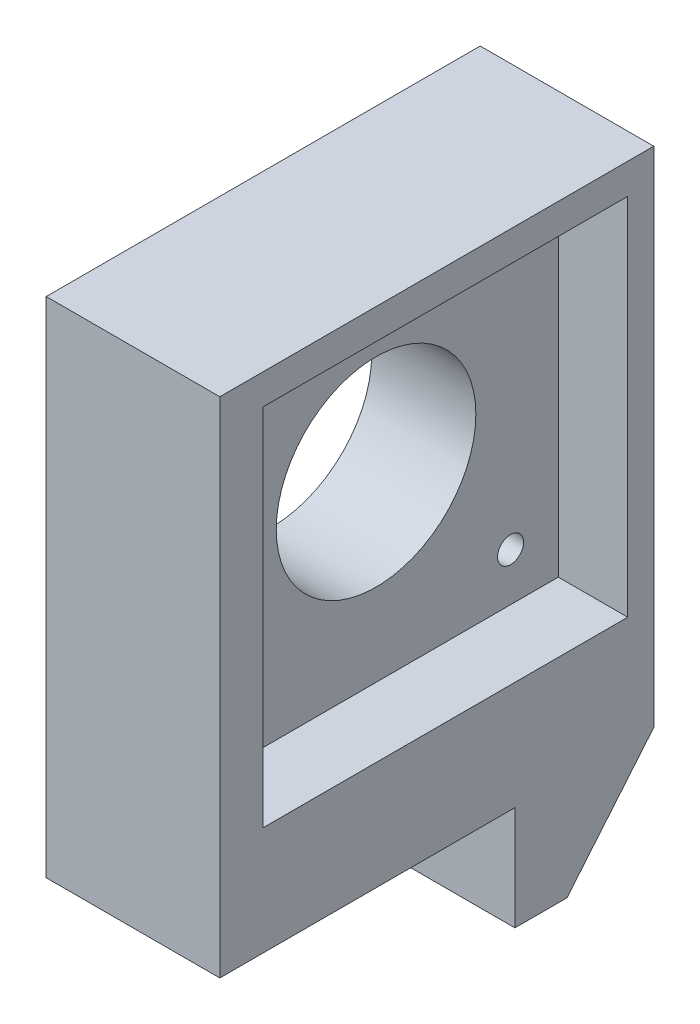
ISO-10303-21;
HEADER;
FILE_DESCRIPTION(('STEP AP214'),'2;1');
FILE_NAME('part.step','',(''),(''),'','','');
FILE_SCHEMA(('AUTOMOTIVE_DESIGN { 1 0 10303 214 1 1 1 1 }'));
ENDSEC;
DATA;
#1=APPLICATION_CONTEXT('core data for automotive mechanical design processes');
#2=APPLICATION_PROTOCOL_DEFINITION('international standard','automotive_design',2000,#1);
#3=PRODUCT_CONTEXT('',#1,'mechanical');
#4=PRODUCT('Part','Part','',(#3));
#5=PRODUCT_RELATED_PRODUCT_CATEGORY('part','',(#4));
#6=PRODUCT_DEFINITION_FORMATION('','',#4);
#7=PRODUCT_DEFINITION_CONTEXT('part definition',#1,'design');
#8=PRODUCT_DEFINITION('design','',#6,#7);
#9=PRODUCT_DEFINITION_SHAPE('','',#8);
#10=(LENGTH_UNIT() NAMED_UNIT(*) SI_UNIT(.MILLI.,.METRE.));
#11=(NAMED_UNIT(*) PLANE_ANGLE_UNIT() SI_UNIT($,.RADIAN.));
#12=(NAMED_UNIT(*) SI_UNIT($,.STERADIAN.) SOLID_ANGLE_UNIT());
#13=UNCERTAINTY_MEASURE_WITH_UNIT(LENGTH_MEASURE(1.E-05),#10,'distance_accuracy_value','');
#14=(GEOMETRIC_REPRESENTATION_CONTEXT(3) GLOBAL_UNCERTAINTY_ASSIGNED_CONTEXT((#13)) GLOBAL_UNIT_ASSIGNED_CONTEXT((#10,
#11,#12)) REPRESENTATION_CONTEXT('',''));
#15=CARTESIAN_POINT('',(0.,0.,0.));
#16=DIRECTION('',(0.,0.,1.));
#17=DIRECTION('',(1.,0.,0.));
#18=AXIS2_PLACEMENT_3D('',#15,#16,#17);
#19=CARTESIAN_POINT('',(0.,70.,0.));
#20=DIRECTION('',(-1.,0.,0.));
#21=DIRECTION('',(0.,0.,1.));
#22=AXIS2_PLACEMENT_3D('',#19,#20,#21);
#23=PLANE('',#22);
#24=DIRECTION('',(0.,0.,1.));
#25=VECTOR('',#24,1.);
#26=CARTESIAN_POINT('',(0.,66.5,3.));
#27=LINE('',#26,#25);
#28=CARTESIAN_POINT('',(0.,66.5,3.));
#29=VERTEX_POINT('',#28);
#30=CARTESIAN_POINT('',(0.,66.5,45.));
#31=VERTEX_POINT('',#30);
#32=EDGE_CURVE('E222',#29,#31,#27,.T.);
#33=ORIENTED_EDGE('',*,*,#32,.F.);
#34=DIRECTION('',(0.,1.,0.));
#35=VECTOR('',#34,1.);
#36=CARTESIAN_POINT('',(0.,66.5,3.));
#37=LINE('',#36,#35);
#38=CARTESIAN_POINT('',(0.,24.5,3.));
#39=VERTEX_POINT('',#38);
#40=EDGE_CURVE('E64',#39,#29,#37,.T.);
#41=ORIENTED_EDGE('',*,*,#40,.F.);
#42=DIRECTION('',(0.,0.,-1.));
#43=VECTOR('',#42,1.);
#44=CARTESIAN_POINT('',(0.,24.5,3.));
#45=LINE('',#44,#43);
#46=CARTESIAN_POINT('',(0.,24.5,45.));
#47=VERTEX_POINT('',#46);
#48=EDGE_CURVE('E231',#47,#39,#45,.T.);
#49=ORIENTED_EDGE('',*,*,#48,.F.);
#50=DIRECTION('',(0.,-1.,0.));
#51=VECTOR('',#50,1.);
#52=CARTESIAN_POINT('',(0.,66.5,45.));
#53=LINE('',#52,#51);
#54=EDGE_CURVE('E225',#31,#47,#53,.T.);
#55=ORIENTED_EDGE('',*,*,#54,.F.);
#56=EDGE_LOOP('',(#33,#41,#49,#55));
#57=FACE_BOUND('',#56,.T.);
#58=DIRECTION('',(0.,0.,-1.));
#59=VECTOR('',#58,1.);
#60=CARTESIAN_POINT('',(0.,0.,0.));
#61=LINE('',#60,#59);
#62=CARTESIAN_POINT('',(0.,0.,16.));
#63=VERTEX_POINT('',#62);
#64=CARTESIAN_POINT('',(0.,0.,10.));
#65=VERTEX_POINT('',#64);
#66=EDGE_CURVE('E138',#63,#65,#61,.T.);
#67=ORIENTED_EDGE('',*,*,#66,.T.);
#68=DIRECTION('',(0.,-0.768221279597376,0.64018439966448));
#69=VECTOR('',#68,1.);
#70=CARTESIAN_POINT('',(0.,12.,0.));
#71=LINE('',#70,#69);
#72=CARTESIAN_POINT('',(0.,12.,0.));
#73=VERTEX_POINT('',#72);
#74=EDGE_CURVE('E56',#73,#65,#71,.T.);
#75=ORIENTED_EDGE('',*,*,#74,.F.);
#76=DIRECTION('',(0.,-1.,0.));
#77=VECTOR('',#76,1.);
#78=CARTESIAN_POINT('',(0.,70.,0.));
#79=LINE('',#78,#77);
#80=CARTESIAN_POINT('',(0.,70.,0.));
#81=VERTEX_POINT('',#80);
#82=EDGE_CURVE('E48',#81,#73,#79,.T.);
#83=ORIENTED_EDGE('',*,*,#82,.F.);
#84=DIRECTION('',(0.,0.,-1.));
#85=VECTOR('',#84,1.);
#86=CARTESIAN_POINT('',(0.,70.,0.));
#87=LINE('',#86,#85);
#88=CARTESIAN_POINT('',(0.,70.,50.));
#89=VERTEX_POINT('',#88);
#90=EDGE_CURVE('E296',#89,#81,#87,.T.);
#91=ORIENTED_EDGE('',*,*,#90,.F.);
#92=DIRECTION('',(0.,-1.,0.));
#93=VECTOR('',#92,1.);
#94=CARTESIAN_POINT('',(0.,70.,50.));
#95=LINE('',#94,#93);
#96=CARTESIAN_POINT('',(0.,12.,50.));
#97=VERTEX_POINT('',#96);
#98=EDGE_CURVE('E308',#89,#97,#95,.T.);
#99=ORIENTED_EDGE('',*,*,#98,.T.);
#100=DIRECTION('',(0.,0.,1.));
#101=VECTOR('',#100,1.);
#102=CARTESIAN_POINT('',(0.,12.,50.));
#103=LINE('',#102,#101);
#104=CARTESIAN_POINT('',(0.,12.,16.));
#105=VERTEX_POINT('',#104);
#106=EDGE_CURVE('E279',#105,#97,#103,.T.);
#107=ORIENTED_EDGE('',*,*,#106,.F.);
#108=DIRECTION('',(0.,1.,0.));
#109=VECTOR('',#108,1.);
#110=CARTESIAN_POINT('',(0.,0.,16.));
#111=LINE('',#110,#109);
#112=EDGE_CURVE('E272',#63,#105,#111,.T.);
#113=ORIENTED_EDGE('',*,*,#112,.F.);
#114=EDGE_LOOP('',(#67,#75,#83,#91,#99,#107,#113));
#115=FACE_BOUND('',#114,.T.);
#116=ADVANCED_FACE('F39',(#57,#115),#23,.F.);
#117=CARTESIAN_POINT('',(0.,70.,0.));
#118=DIRECTION('',(0.,0.,1.));
#119=DIRECTION('',(1.,0.,0.));
#120=AXIS2_PLACEMENT_3D('',#117,#118,#119);
#121=PLANE('',#120);
#122=ORIENTED_EDGE('',*,*,#82,.T.);
#123=DIRECTION('',(1.,0.,0.));
#124=VECTOR('',#123,1.);
#125=CARTESIAN_POINT('',(-30.,12.,0.));
#126=LINE('',#125,#124);
#127=CARTESIAN_POINT('',(-20.,12.,0.));
#128=VERTEX_POINT('',#127);
#129=EDGE_CURVE('E121',#128,#73,#126,.T.);
#130=ORIENTED_EDGE('',*,*,#129,.F.);
#131=DIRECTION('',(0.,-1.,0.));
#132=VECTOR('',#131,1.);
#133=CARTESIAN_POINT('',(-20.,70.,0.));
#134=LINE('',#133,#132);
#135=CARTESIAN_POINT('',(-20.,70.,0.));
#136=VERTEX_POINT('',#135);
#137=EDGE_CURVE('E145',#136,#128,#134,.T.);
#138=ORIENTED_EDGE('',*,*,#137,.F.);
#139=DIRECTION('',(-1.,0.,0.));
#140=VECTOR('',#139,1.);
#141=CARTESIAN_POINT('',(0.,70.,0.));
#142=LINE('',#141,#140);
#143=EDGE_CURVE('E142',#81,#136,#142,.T.);
#144=ORIENTED_EDGE('',*,*,#143,.F.);
#145=EDGE_LOOP('',(#122,#130,#138,#144));
#146=FACE_BOUND('',#145,.T.);
#147=ADVANCED_FACE('F141',(#146),#121,.F.);
#148=CARTESIAN_POINT('',(-20.,70.,0.));
#149=DIRECTION('',(1.,0.,0.));
#150=DIRECTION('',(0.,0.,-1.));
#151=AXIS2_PLACEMENT_3D('',#148,#149,#150);
#152=PLANE('',#151);
#153=CARTESIAN_POINT('',(-20.,20.,46.));
#154=DIRECTION('',(-1.,0.,0.));
#155=DIRECTION('',(0.,0.,1.));
#156=AXIS2_PLACEMENT_3D('',#153,#154,#155);
#157=CIRCLE('',#156,1.5);
#158=CARTESIAN_POINT('',(-20.,20.,47.5));
#159=VERTEX_POINT('',#158);
#160=EDGE_CURVE('E433',#159,#159,#157,.T.);
#161=ORIENTED_EDGE('',*,*,#160,.F.);
#162=EDGE_LOOP('',(#161));
#163=FACE_BOUND('',#162,.T.);
#164=CARTESIAN_POINT('',(-20.,20.,39.));
#165=DIRECTION('',(-1.,0.,0.));
#166=DIRECTION('',(0.,0.,1.));
#167=AXIS2_PLACEMENT_3D('',#164,#165,#166);
#168=CIRCLE('',#167,1.5);
#169=CARTESIAN_POINT('',(-20.,20.,40.5));
#170=VERTEX_POINT('',#169);
#171=EDGE_CURVE('E437',#170,#170,#168,.T.);
#172=ORIENTED_EDGE('',*,*,#171,.F.);
#173=EDGE_LOOP('',(#172));
#174=FACE_BOUND('',#173,.T.);
#175=CARTESIAN_POINT('',(-20.,45.5,24.));
#176=DIRECTION('',(1.,0.,0.));
#177=DIRECTION('',(0.,0.,-1.));
#178=AXIS2_PLACEMENT_3D('',#175,#176,#177);
#179=CIRCLE('',#178,11.5);
#180=CARTESIAN_POINT('',(-20.,45.5,12.5));
#181=VERTEX_POINT('',#180);
#182=EDGE_CURVE('E169',#181,#181,#179,.T.);
#183=ORIENTED_EDGE('',*,*,#182,.T.);
#184=EDGE_LOOP('',(#183));
#185=FACE_BOUND('',#184,.T.);
#186=CARTESIAN_POINT('',(-20.,61.,39.5));
#187=DIRECTION('',(1.,0.,0.));
#188=DIRECTION('',(0.,0.,-1.));
#189=AXIS2_PLACEMENT_3D('',#186,#187,#188);
#190=CIRCLE('',#189,1.5);
#191=CARTESIAN_POINT('',(-20.,61.,38.));
#192=VERTEX_POINT('',#191);
#193=EDGE_CURVE('E165',#192,#192,#190,.T.);
#194=ORIENTED_EDGE('',*,*,#193,.T.);
#195=EDGE_LOOP('',(#194));
#196=FACE_BOUND('',#195,.T.);
#197=CARTESIAN_POINT('',(-20.,30.,39.5));
#198=DIRECTION('',(1.,0.,0.));
#199=DIRECTION('',(0.,0.,-1.));
#200=AXIS2_PLACEMENT_3D('',#197,#198,#199);
#201=CIRCLE('',#200,1.5);
#202=CARTESIAN_POINT('',(-20.,30.,38.));
#203=VERTEX_POINT('',#202);
#204=EDGE_CURVE('E161',#203,#203,#201,.T.);
#205=ORIENTED_EDGE('',*,*,#204,.T.);
#206=EDGE_LOOP('',(#205));
#207=FACE_BOUND('',#206,.T.);
#208=CARTESIAN_POINT('',(-20.,30.,8.50000000000001));
#209=DIRECTION('',(1.,0.,0.));
#210=DIRECTION('',(0.,0.,-1.));
#211=AXIS2_PLACEMENT_3D('',#208,#209,#210);
#212=CIRCLE('',#211,1.5);
#213=CARTESIAN_POINT('',(-20.,30.,7.00000000000001));
#214=VERTEX_POINT('',#213);
#215=EDGE_CURVE('E156',#214,#214,#212,.T.);
#216=ORIENTED_EDGE('',*,*,#215,.T.);
#217=EDGE_LOOP('',(#216));
#218=FACE_BOUND('',#217,.T.);
#219=CARTESIAN_POINT('',(-20.,61.,8.50000000000001));
#220=DIRECTION('',(1.,0.,0.));
#221=DIRECTION('',(0.,0.,-1.));
#222=AXIS2_PLACEMENT_3D('',#219,#220,#221);
#223=CIRCLE('',#222,1.5);
#224=CARTESIAN_POINT('',(-20.,61.,7.00000000000001));
#225=VERTEX_POINT('',#224);
#226=EDGE_CURVE('E152',#225,#225,#223,.T.);
#227=ORIENTED_EDGE('',*,*,#226,.T.);
#228=EDGE_LOOP('',(#227));
#229=FACE_BOUND('',#228,.T.);
#230=ORIENTED_EDGE('',*,*,#137,.T.);
#231=DIRECTION('',(0.,-0.768221279597376,0.64018439966448));
#232=VECTOR('',#231,1.);
#233=CARTESIAN_POINT('',(-20.,46.2295081967213,-28.5245901639344));
#234=LINE('',#233,#232);
#235=CARTESIAN_POINT('',(-20.,0.,10.));
#236=VERTEX_POINT('',#235);
#237=EDGE_CURVE('E124',#128,#236,#234,.T.);
#238=ORIENTED_EDGE('',*,*,#237,.T.);
#239=DIRECTION('',(0.,0.,1.));
#240=VECTOR('',#239,1.);
#241=CARTESIAN_POINT('',(-20.,0.,0.));
#242=LINE('',#241,#240);
#243=CARTESIAN_POINT('',(-20.,0.,16.));
#244=VERTEX_POINT('',#243);
#245=EDGE_CURVE('E299',#236,#244,#242,.T.);
#246=ORIENTED_EDGE('',*,*,#245,.T.);
#247=DIRECTION('',(0.,1.,0.));
#248=VECTOR('',#247,1.);
#249=CARTESIAN_POINT('',(-20.,70.,16.));
#250=LINE('',#249,#248);
#251=CARTESIAN_POINT('',(-20.,12.,16.));
#252=VERTEX_POINT('',#251);
#253=EDGE_CURVE('E287',#244,#252,#250,.T.);
#254=ORIENTED_EDGE('',*,*,#253,.T.);
#255=DIRECTION('',(0.,0.,1.));
#256=VECTOR('',#255,1.);
#257=CARTESIAN_POINT('',(-20.,12.,0.));
#258=LINE('',#257,#256);
#259=CARTESIAN_POINT('',(-20.,12.,50.));
#260=VERTEX_POINT('',#259);
#261=EDGE_CURVE('E157',#252,#260,#258,.T.);
#262=ORIENTED_EDGE('',*,*,#261,.T.);
#263=DIRECTION('',(0.,-1.,0.));
#264=VECTOR('',#263,1.);
#265=CARTESIAN_POINT('',(-20.,70.,50.));
#266=LINE('',#265,#264);
#267=CARTESIAN_POINT('',(-20.,70.,50.));
#268=VERTEX_POINT('',#267);
#269=EDGE_CURVE('E148',#268,#260,#266,.T.);
#270=ORIENTED_EDGE('',*,*,#269,.F.);
#271=DIRECTION('',(0.,0.,1.));
#272=VECTOR('',#271,1.);
#273=CARTESIAN_POINT('',(-20.,70.,0.));
#274=LINE('',#273,#272);
#275=EDGE_CURVE('E302',#136,#268,#274,.T.);
#276=ORIENTED_EDGE('',*,*,#275,.F.);
#277=EDGE_LOOP('',(#230,#238,#246,#254,#262,#270,#276));
#278=FACE_BOUND('',#277,.T.);
#279=ADVANCED_FACE('F218',(#163,#174,#185,#196,#207,#218,#229,#278),#152,.F.);
#280=CARTESIAN_POINT('',(0.,70.,50.));
#281=DIRECTION('',(0.,0.,-1.));
#282=DIRECTION('',(-1.,0.,0.));
#283=AXIS2_PLACEMENT_3D('',#280,#281,#282);
#284=PLANE('',#283);
#285=ORIENTED_EDGE('',*,*,#269,.T.);
#286=DIRECTION('',(1.,0.,0.));
#287=VECTOR('',#286,1.);
#288=CARTESIAN_POINT('',(-60.,12.,50.));
#289=LINE('',#288,#287);
#290=EDGE_CURVE('E283',#260,#97,#289,.T.);
#291=ORIENTED_EDGE('',*,*,#290,.T.);
#292=ORIENTED_EDGE('',*,*,#98,.F.);
#293=DIRECTION('',(1.,0.,0.));
#294=VECTOR('',#293,1.);
#295=CARTESIAN_POINT('',(0.,70.,50.));
#296=LINE('',#295,#294);
#297=EDGE_CURVE('E305',#268,#89,#296,.T.);
#298=ORIENTED_EDGE('',*,*,#297,.F.);
#299=EDGE_LOOP('',(#285,#291,#292,#298));
#300=FACE_BOUND('',#299,.T.);
#301=ADVANCED_FACE('F320',(#300),#284,.F.);
#302=CARTESIAN_POINT('',(0.,70.,0.));
#303=DIRECTION('',(0.,-1.,0.));
#304=DIRECTION('',(0.,0.,-1.));
#305=AXIS2_PLACEMENT_3D('',#302,#303,#304);
#306=PLANE('',#305);
#307=ORIENTED_EDGE('',*,*,#90,.T.);
#308=ORIENTED_EDGE('',*,*,#143,.T.);
#309=ORIENTED_EDGE('',*,*,#275,.T.);
#310=ORIENTED_EDGE('',*,*,#297,.T.);
#311=EDGE_LOOP('',(#307,#308,#309,#310));
#312=FACE_BOUND('',#311,.T.);
#313=ADVANCED_FACE('F333',(#312),#306,.F.);
#314=CARTESIAN_POINT('',(0.,0.,0.));
#315=DIRECTION('',(0.,-1.,0.));
#316=DIRECTION('',(0.,0.,-1.));
#317=AXIS2_PLACEMENT_3D('',#314,#315,#316);
#318=PLANE('',#317);
#319=DIRECTION('',(1.,0.,0.));
#320=VECTOR('',#319,1.);
#321=CARTESIAN_POINT('',(-30.,0.,10.));
#322=LINE('',#321,#320);
#323=EDGE_CURVE('E130',#236,#65,#322,.T.);
#324=ORIENTED_EDGE('',*,*,#323,.T.);
#325=ORIENTED_EDGE('',*,*,#66,.F.);
#326=DIRECTION('',(1.,0.,0.));
#327=VECTOR('',#326,1.);
#328=CARTESIAN_POINT('',(0.,0.,16.));
#329=LINE('',#328,#327);
#330=EDGE_CURVE('E11',#244,#63,#329,.T.);
#331=ORIENTED_EDGE('',*,*,#330,.F.);
#332=ORIENTED_EDGE('',*,*,#245,.F.);
#333=EDGE_LOOP('',(#324,#325,#331,#332));
#334=FACE_BOUND('',#333,.T.);
#335=ADVANCED_FACE('F338',(#334),#318,.T.);
#336=CARTESIAN_POINT('',(-60.,61.,8.50000000000001));
#337=DIRECTION('',(1.,0.,0.));
#338=DIRECTION('',(0.,0.,-1.));
#339=AXIS2_PLACEMENT_3D('',#336,#337,#338);
#340=CYLINDRICAL_SURFACE('',#339,1.5);
#341=CARTESIAN_POINT('',(-8.,61.,8.50000000000001));
#342=DIRECTION('',(-1.,0.,0.));
#343=DIRECTION('',(0.,0.,1.));
#344=AXIS2_PLACEMENT_3D('',#341,#342,#343);
#345=CIRCLE('',#344,1.5);
#346=CARTESIAN_POINT('',(-8.,61.,10.));
#347=VERTEX_POINT('',#346);
#348=EDGE_CURVE('E263',#347,#347,#345,.F.);
#349=ORIENTED_EDGE('',*,*,#348,.T.);
#350=EDGE_LOOP('',(#349));
#351=FACE_BOUND('',#350,.T.);
#352=ORIENTED_EDGE('',*,*,#226,.F.);
#353=EDGE_LOOP('',(#352));
#354=FACE_BOUND('',#353,.T.);
#355=ADVANCED_FACE('F405',(#351,#354),#340,.F.);
#356=CARTESIAN_POINT('',(-60.,30.,8.50000000000001));
#357=DIRECTION('',(1.,0.,0.));
#358=DIRECTION('',(0.,0.,-1.));
#359=AXIS2_PLACEMENT_3D('',#356,#357,#358);
#360=CYLINDRICAL_SURFACE('',#359,1.5);
#361=CARTESIAN_POINT('',(-8.,30.,8.5));
#362=DIRECTION('',(-1.,0.,0.));
#363=DIRECTION('',(0.,0.,1.));
#364=AXIS2_PLACEMENT_3D('',#361,#362,#363);
#365=CIRCLE('',#364,1.5);
#366=CARTESIAN_POINT('',(-8.,30.,10.));
#367=VERTEX_POINT('',#366);
#368=EDGE_CURVE('E259',#367,#367,#365,.F.);
#369=ORIENTED_EDGE('',*,*,#368,.T.);
#370=EDGE_LOOP('',(#369));
#371=FACE_BOUND('',#370,.T.);
#372=ORIENTED_EDGE('',*,*,#215,.F.);
#373=EDGE_LOOP('',(#372));
#374=FACE_BOUND('',#373,.T.);
#375=ADVANCED_FACE('F401',(#371,#374),#360,.F.);
#376=CARTESIAN_POINT('',(-60.,30.,39.5));
#377=DIRECTION('',(1.,0.,0.));
#378=DIRECTION('',(0.,0.,-1.));
#379=AXIS2_PLACEMENT_3D('',#376,#377,#378);
#380=CYLINDRICAL_SURFACE('',#379,1.5);
#381=CARTESIAN_POINT('',(-7.99999999999999,30.,39.5));
#382=DIRECTION('',(-1.,0.,0.));
#383=DIRECTION('',(0.,0.,1.));
#384=AXIS2_PLACEMENT_3D('',#381,#382,#383);
#385=CIRCLE('',#384,1.5);
#386=CARTESIAN_POINT('',(-7.99999999999999,30.,41.));
#387=VERTEX_POINT('',#386);
#388=EDGE_CURVE('E255',#387,#387,#385,.F.);
#389=ORIENTED_EDGE('',*,*,#388,.T.);
#390=EDGE_LOOP('',(#389));
#391=FACE_BOUND('',#390,.T.);
#392=ORIENTED_EDGE('',*,*,#204,.F.);
#393=EDGE_LOOP('',(#392));
#394=FACE_BOUND('',#393,.T.);
#395=ADVANCED_FACE('F404',(#391,#394),#380,.F.);
#396=CARTESIAN_POINT('',(-60.,61.,39.5));
#397=DIRECTION('',(1.,0.,0.));
#398=DIRECTION('',(0.,0.,-1.));
#399=AXIS2_PLACEMENT_3D('',#396,#397,#398);
#400=CYLINDRICAL_SURFACE('',#399,1.5);
#401=CARTESIAN_POINT('',(-7.99999999999999,61.,39.5));
#402=DIRECTION('',(-1.,0.,0.));
#403=DIRECTION('',(0.,0.,1.));
#404=AXIS2_PLACEMENT_3D('',#401,#402,#403);
#405=CIRCLE('',#404,1.5);
#406=CARTESIAN_POINT('',(-7.99999999999999,61.,41.));
#407=VERTEX_POINT('',#406);
#408=EDGE_CURVE('E177',#407,#407,#405,.F.);
#409=ORIENTED_EDGE('',*,*,#408,.T.);
#410=EDGE_LOOP('',(#409));
#411=FACE_BOUND('',#410,.T.);
#412=ORIENTED_EDGE('',*,*,#193,.F.);
#413=EDGE_LOOP('',(#412));
#414=FACE_BOUND('',#413,.T.);
#415=ADVANCED_FACE('F409',(#411,#414),#400,.F.);
#416=CARTESIAN_POINT('',(-60.,45.5,24.));
#417=DIRECTION('',(1.,0.,0.));
#418=DIRECTION('',(0.,0.,-1.));
#419=AXIS2_PLACEMENT_3D('',#416,#417,#418);
#420=CYLINDRICAL_SURFACE('',#419,11.5);
#421=CARTESIAN_POINT('',(-8.,45.5,24.));
#422=DIRECTION('',(-1.,0.,0.));
#423=DIRECTION('',(0.,0.,1.));
#424=AXIS2_PLACEMENT_3D('',#421,#422,#423);
#425=CIRCLE('',#424,11.5);
#426=CARTESIAN_POINT('',(-8.,45.5,35.5));
#427=VERTEX_POINT('',#426);
#428=EDGE_CURVE('E173',#427,#427,#425,.F.);
#429=ORIENTED_EDGE('',*,*,#428,.T.);
#430=EDGE_LOOP('',(#429));
#431=FACE_BOUND('',#430,.T.);
#432=ORIENTED_EDGE('',*,*,#182,.F.);
#433=EDGE_LOOP('',(#432));
#434=FACE_BOUND('',#433,.T.);
#435=ADVANCED_FACE('F398',(#431,#434),#420,.F.);
#436=CARTESIAN_POINT('',(-60.,12.,50.));
#437=DIRECTION('',(0.,1.,0.));
#438=DIRECTION('',(0.,0.,1.));
#439=AXIS2_PLACEMENT_3D('',#436,#437,#438);
#440=PLANE('',#439);
#441=DIRECTION('',(1.,0.,0.));
#442=VECTOR('',#441,1.);
#443=CARTESIAN_POINT('',(-60.,12.,16.));
#444=LINE('',#443,#442);
#445=EDGE_CURVE('E282',#252,#105,#444,.T.);
#446=ORIENTED_EDGE('',*,*,#445,.T.);
#447=ORIENTED_EDGE('',*,*,#106,.T.);
#448=ORIENTED_EDGE('',*,*,#290,.F.);
#449=ORIENTED_EDGE('',*,*,#261,.F.);
#450=EDGE_LOOP('',(#446,#447,#448,#449));
#451=FACE_BOUND('',#450,.T.);
#452=ADVANCED_FACE('F327',(#451),#440,.F.);
#453=CARTESIAN_POINT('',(-60.,0.,16.));
#454=DIRECTION('',(0.,0.,-1.));
#455=DIRECTION('',(-1.,0.,0.));
#456=AXIS2_PLACEMENT_3D('',#453,#454,#455);
#457=PLANE('',#456);
#458=ORIENTED_EDGE('',*,*,#330,.T.);
#459=ORIENTED_EDGE('',*,*,#112,.T.);
#460=ORIENTED_EDGE('',*,*,#445,.F.);
#461=ORIENTED_EDGE('',*,*,#253,.F.);
#462=EDGE_LOOP('',(#458,#459,#460,#461));
#463=FACE_BOUND('',#462,.T.);
#464=ADVANCED_FACE('F329',(#463),#457,.F.);
#465=CARTESIAN_POINT('',(-8.,0.,0.));
#466=DIRECTION('',(-1.,0.,0.));
#467=DIRECTION('',(0.,0.,1.));
#468=AXIS2_PLACEMENT_3D('',#465,#466,#467);
#469=PLANE('',#468);
#470=ORIENTED_EDGE('',*,*,#368,.F.);
#471=EDGE_LOOP('',(#470));
#472=FACE_BOUND('',#471,.T.);
#473=ORIENTED_EDGE('',*,*,#408,.F.);
#474=EDGE_LOOP('',(#473));
#475=FACE_BOUND('',#474,.T.);
#476=DIRECTION('',(0.,1.,0.));
#477=VECTOR('',#476,1.);
#478=CARTESIAN_POINT('',(-8.,66.5,3.));
#479=LINE('',#478,#477);
#480=CARTESIAN_POINT('',(-8.,24.5,3.));
#481=VERTEX_POINT('',#480);
#482=CARTESIAN_POINT('',(-8.,66.5,3.));
#483=VERTEX_POINT('',#482);
#484=EDGE_CURVE('E239',#481,#483,#479,.T.);
#485=ORIENTED_EDGE('',*,*,#484,.T.);
#486=DIRECTION('',(0.,0.,1.));
#487=VECTOR('',#486,1.);
#488=CARTESIAN_POINT('',(-8.,66.5,3.));
#489=LINE('',#488,#487);
#490=CARTESIAN_POINT('',(-7.99999999999999,66.5,45.));
#491=VERTEX_POINT('',#490);
#492=EDGE_CURVE('E345',#483,#491,#489,.T.);
#493=ORIENTED_EDGE('',*,*,#492,.T.);
#494=DIRECTION('',(0.,-1.,0.));
#495=VECTOR('',#494,1.);
#496=CARTESIAN_POINT('',(-7.99999999999999,66.5,45.));
#497=LINE('',#496,#495);
#498=CARTESIAN_POINT('',(-7.99999999999999,24.5,45.));
#499=VERTEX_POINT('',#498);
#500=EDGE_CURVE('E349',#491,#499,#497,.T.);
#501=ORIENTED_EDGE('',*,*,#500,.T.);
#502=DIRECTION('',(0.,0.,-1.));
#503=VECTOR('',#502,1.);
#504=CARTESIAN_POINT('',(-8.,24.5,3.));
#505=LINE('',#504,#503);
#506=EDGE_CURVE('E251',#499,#481,#505,.T.);
#507=ORIENTED_EDGE('',*,*,#506,.T.);
#508=EDGE_LOOP('',(#485,#493,#501,#507));
#509=FACE_BOUND('',#508,.T.);
#510=ORIENTED_EDGE('',*,*,#428,.F.);
#511=EDGE_LOOP('',(#510));
#512=FACE_BOUND('',#511,.T.);
#513=ORIENTED_EDGE('',*,*,#388,.F.);
#514=EDGE_LOOP('',(#513));
#515=FACE_BOUND('',#514,.T.);
#516=ORIENTED_EDGE('',*,*,#348,.F.);
#517=EDGE_LOOP('',(#516));
#518=FACE_BOUND('',#517,.T.);
#519=ADVANCED_FACE('F356',(#472,#475,#509,#512,#515,#518),#469,.F.);
#520=CARTESIAN_POINT('',(-8.,66.5,3.));
#521=DIRECTION('',(0.,0.,-1.));
#522=DIRECTION('',(0.,1.,0.));
#523=AXIS2_PLACEMENT_3D('',#520,#521,#522);
#524=PLANE('',#523);
#525=ORIENTED_EDGE('',*,*,#40,.T.);
#526=DIRECTION('',(1.,0.,0.));
#527=VECTOR('',#526,1.);
#528=CARTESIAN_POINT('',(-8.,66.5,3.));
#529=LINE('',#528,#527);
#530=EDGE_CURVE('E248',#483,#29,#529,.T.);
#531=ORIENTED_EDGE('',*,*,#530,.F.);
#532=ORIENTED_EDGE('',*,*,#484,.F.);
#533=DIRECTION('',(1.,0.,0.));
#534=VECTOR('',#533,1.);
#535=CARTESIAN_POINT('',(-8.,24.5,3.));
#536=LINE('',#535,#534);
#537=EDGE_CURVE('E178',#481,#39,#536,.T.);
#538=ORIENTED_EDGE('',*,*,#537,.T.);
#539=EDGE_LOOP('',(#525,#531,#532,#538));
#540=FACE_BOUND('',#539,.T.);
#541=ADVANCED_FACE('F362',(#540),#524,.F.);
#542=CARTESIAN_POINT('',(-8.,24.5,3.));
#543=DIRECTION('',(0.,-1.,0.));
#544=DIRECTION('',(0.,0.,-1.));
#545=AXIS2_PLACEMENT_3D('',#542,#543,#544);
#546=PLANE('',#545);
#547=ORIENTED_EDGE('',*,*,#48,.T.);
#548=ORIENTED_EDGE('',*,*,#537,.F.);
#549=ORIENTED_EDGE('',*,*,#506,.F.);
#550=DIRECTION('',(1.,0.,0.));
#551=VECTOR('',#550,1.);
#552=CARTESIAN_POINT('',(-7.99999999999999,24.5,45.));
#553=LINE('',#552,#551);
#554=EDGE_CURVE('E242',#499,#47,#553,.T.);
#555=ORIENTED_EDGE('',*,*,#554,.T.);
#556=EDGE_LOOP('',(#547,#548,#549,#555));
#557=FACE_BOUND('',#556,.T.);
#558=ADVANCED_FACE('F361',(#557),#546,.F.);
#559=CARTESIAN_POINT('',(-7.99999999999999,66.5,45.));
#560=DIRECTION('',(0.,0.,1.));
#561=DIRECTION('',(0.,-1.,0.));
#562=AXIS2_PLACEMENT_3D('',#559,#560,#561);
#563=PLANE('',#562);
#564=ORIENTED_EDGE('',*,*,#54,.T.);
#565=ORIENTED_EDGE('',*,*,#554,.F.);
#566=ORIENTED_EDGE('',*,*,#500,.F.);
#567=DIRECTION('',(1.,0.,0.));
#568=VECTOR('',#567,1.);
#569=CARTESIAN_POINT('',(-7.99999999999999,66.5,45.));
#570=LINE('',#569,#568);
#571=EDGE_CURVE('E245',#491,#31,#570,.T.);
#572=ORIENTED_EDGE('',*,*,#571,.T.);
#573=EDGE_LOOP('',(#564,#565,#566,#572));
#574=FACE_BOUND('',#573,.T.);
#575=ADVANCED_FACE('F365',(#574),#563,.F.);
#576=CARTESIAN_POINT('',(-8.,66.5,3.));
#577=DIRECTION('',(0.,1.,0.));
#578=DIRECTION('',(0.,0.,1.));
#579=AXIS2_PLACEMENT_3D('',#576,#577,#578);
#580=PLANE('',#579);
#581=ORIENTED_EDGE('',*,*,#32,.T.);
#582=ORIENTED_EDGE('',*,*,#571,.F.);
#583=ORIENTED_EDGE('',*,*,#492,.F.);
#584=ORIENTED_EDGE('',*,*,#530,.T.);
#585=EDGE_LOOP('',(#581,#582,#583,#584));
#586=FACE_BOUND('',#585,.T.);
#587=ADVANCED_FACE('F209',(#586),#580,.F.);
#588=CARTESIAN_POINT('',(-30.,12.,0.));
#589=DIRECTION('',(0.,0.64018439966448,0.768221279597376));
#590=DIRECTION('',(0.,-0.768221279597376,0.64018439966448));
#591=AXIS2_PLACEMENT_3D('',#588,#589,#590);
#592=PLANE('',#591);
#593=CARTESIAN_POINT('',(-15.,6.,5.));
#594=DIRECTION('',(0.,0.64018439966448,0.768221279597376));
#595=DIRECTION('',(0.,0.768221279597376,-0.64018439966448));
#596=AXIS2_PLACEMENT_3D('',#593,#594,#595);
#597=ELLIPSE('',#596,4.55597897761221,3.5);
#598=CARTESIAN_POINT('',(-15.,9.5,2.08333333333333));
#599=VERTEX_POINT('',#598);
#600=EDGE_CURVE('E42',#599,#599,#597,.T.);
#601=ORIENTED_EDGE('',*,*,#600,.T.);
#602=EDGE_LOOP('',(#601));
#603=FACE_BOUND('',#602,.T.);
#604=CARTESIAN_POINT('',(-5.,6.,5.));
#605=DIRECTION('',(0.,0.64018439966448,0.768221279597376));
#606=DIRECTION('',(0.,0.768221279597376,-0.64018439966448));
#607=AXIS2_PLACEMENT_3D('',#604,#605,#606);
#608=ELLIPSE('',#607,4.55597897761221,3.5);
#609=CARTESIAN_POINT('',(-5.,9.5,2.08333333333333));
#610=VERTEX_POINT('',#609);
#611=EDGE_CURVE('E187',#610,#610,#608,.T.);
#612=ORIENTED_EDGE('',*,*,#611,.T.);
#613=EDGE_LOOP('',(#612));
#614=FACE_BOUND('',#613,.T.);
#615=ORIENTED_EDGE('',*,*,#129,.T.);
#616=ORIENTED_EDGE('',*,*,#74,.T.);
#617=ORIENTED_EDGE('',*,*,#323,.F.);
#618=ORIENTED_EDGE('',*,*,#237,.F.);
#619=EDGE_LOOP('',(#615,#616,#617,#618));
#620=FACE_BOUND('',#619,.T.);
#621=ADVANCED_FACE('F122',(#603,#614,#620),#592,.F.);
#622=CARTESIAN_POINT('',(-15.,6.,9.18109305044368));
#623=DIRECTION('',(0.,0.,-1.));
#624=DIRECTION('',(-1.,0.,0.));
#625=AXIS2_PLACEMENT_3D('',#622,#623,#624);
#626=CYLINDRICAL_SURFACE('',#625,3.5);
#627=CARTESIAN_POINT('',(-15.,6.,9.18109305044368));
#628=DIRECTION('',(0.,0.,-1.));
#629=DIRECTION('',(-1.,0.,0.));
#630=AXIS2_PLACEMENT_3D('',#627,#628,#629);
#631=CIRCLE('',#630,3.5);
#632=CARTESIAN_POINT('',(-18.5,6.,9.18109305044368));
#633=VERTEX_POINT('',#632);
#634=EDGE_CURVE('E184',#633,#633,#631,.T.);
#635=ORIENTED_EDGE('',*,*,#634,.F.);
#636=EDGE_LOOP('',(#635));
#637=FACE_BOUND('',#636,.T.);
#638=ORIENTED_EDGE('',*,*,#600,.F.);
#639=EDGE_LOOP('',(#638));
#640=FACE_BOUND('',#639,.T.);
#641=ADVANCED_FACE('F197',(#637,#640),#626,.F.);
#642=CARTESIAN_POINT('',(-15.,6.,9.18109305044368));
#643=DIRECTION('',(0.,0.,-1.));
#644=DIRECTION('',(-1.,0.,0.));
#645=AXIS2_PLACEMENT_3D('',#642,#643,#644);
#646=PLANE('',#645);
#647=ORIENTED_EDGE('',*,*,#634,.T.);
#648=EDGE_LOOP('',(#647));
#649=FACE_BOUND('',#648,.T.);
#650=CARTESIAN_POINT('',(-15.,6.,9.18109305044368));
#651=DIRECTION('',(0.,0.,-1.));
#652=DIRECTION('',(-1.,0.,0.));
#653=AXIS2_PLACEMENT_3D('',#650,#651,#652);
#654=CIRCLE('',#653,2.);
#655=CARTESIAN_POINT('',(-17.,6.,9.18109305044368));
#656=VERTEX_POINT('',#655);
#657=EDGE_CURVE('E179',#656,#656,#654,.F.);
#658=ORIENTED_EDGE('',*,*,#657,.T.);
#659=EDGE_LOOP('',(#658));
#660=FACE_BOUND('',#659,.T.);
#661=ADVANCED_FACE('F199',(#649,#660),#646,.T.);
#662=CARTESIAN_POINT('',(-5.,6.,9.18109305044368));
#663=DIRECTION('',(0.,0.,-1.));
#664=DIRECTION('',(-1.,0.,0.));
#665=AXIS2_PLACEMENT_3D('',#662,#663,#664);
#666=CYLINDRICAL_SURFACE('',#665,3.5);
#667=CARTESIAN_POINT('',(-5.,6.,9.18109305044368));
#668=DIRECTION('',(0.,0.,-1.));
#669=DIRECTION('',(-1.,0.,0.));
#670=AXIS2_PLACEMENT_3D('',#667,#668,#669);
#671=CIRCLE('',#670,3.5);
#672=CARTESIAN_POINT('',(-8.5,6.,9.18109305044368));
#673=VERTEX_POINT('',#672);
#674=EDGE_CURVE('E464',#673,#673,#671,.T.);
#675=ORIENTED_EDGE('',*,*,#674,.F.);
#676=EDGE_LOOP('',(#675));
#677=FACE_BOUND('',#676,.T.);
#678=ORIENTED_EDGE('',*,*,#611,.F.);
#679=EDGE_LOOP('',(#678));
#680=FACE_BOUND('',#679,.T.);
#681=ADVANCED_FACE('F206',(#677,#680),#666,.F.);
#682=CARTESIAN_POINT('',(-5.,6.,9.18109305044368));
#683=DIRECTION('',(0.,0.,-1.));
#684=DIRECTION('',(-1.,0.,0.));
#685=AXIS2_PLACEMENT_3D('',#682,#683,#684);
#686=PLANE('',#685);
#687=ORIENTED_EDGE('',*,*,#674,.T.);
#688=EDGE_LOOP('',(#687));
#689=FACE_BOUND('',#688,.T.);
#690=CARTESIAN_POINT('',(-5.,6.,9.18109305044368));
#691=DIRECTION('',(0.,0.,-1.));
#692=DIRECTION('',(-1.,0.,0.));
#693=AXIS2_PLACEMENT_3D('',#690,#691,#692);
#694=CIRCLE('',#693,2.);
#695=CARTESIAN_POINT('',(-7.,6.,9.18109305044368));
#696=VERTEX_POINT('',#695);
#697=EDGE_CURVE('E183',#696,#696,#694,.F.);
#698=ORIENTED_EDGE('',*,*,#697,.T.);
#699=EDGE_LOOP('',(#698));
#700=FACE_BOUND('',#699,.T.);
#701=ADVANCED_FACE('F382',(#689,#700),#686,.T.);
#702=CARTESIAN_POINT('',(-15.,6.,15.));
#703=DIRECTION('',(0.,0.,-1.));
#704=DIRECTION('',(-1.,0.,0.));
#705=AXIS2_PLACEMENT_3D('',#702,#703,#704);
#706=PLANE('',#705);
#707=CARTESIAN_POINT('',(-15.,6.,15.));
#708=DIRECTION('',(0.,0.,-1.));
#709=DIRECTION('',(-1.,0.,0.));
#710=AXIS2_PLACEMENT_3D('',#707,#708,#709);
#711=CIRCLE('',#710,2.);
#712=CARTESIAN_POINT('',(-17.,6.,15.));
#713=VERTEX_POINT('',#712);
#714=EDGE_CURVE('E268',#713,#713,#711,.T.);
#715=ORIENTED_EDGE('',*,*,#714,.T.);
#716=EDGE_LOOP('',(#715));
#717=FACE_BOUND('',#716,.T.);
#718=ADVANCED_FACE('F378',(#717),#706,.T.);
#719=CARTESIAN_POINT('',(-15.,6.,15.));
#720=DIRECTION('',(0.,0.,-1.));
#721=DIRECTION('',(-1.,0.,0.));
#722=AXIS2_PLACEMENT_3D('',#719,#720,#721);
#723=CYLINDRICAL_SURFACE('',#722,2.);
#724=ORIENTED_EDGE('',*,*,#714,.F.);
#725=EDGE_LOOP('',(#724));
#726=FACE_BOUND('',#725,.T.);
#727=ORIENTED_EDGE('',*,*,#657,.F.);
#728=EDGE_LOOP('',(#727));
#729=FACE_BOUND('',#728,.T.);
#730=ADVANCED_FACE('F381',(#726,#729),#723,.F.);
#731=CARTESIAN_POINT('',(-5.,6.,15.));
#732=DIRECTION('',(0.,0.,-1.));
#733=DIRECTION('',(-1.,0.,0.));
#734=AXIS2_PLACEMENT_3D('',#731,#732,#733);
#735=PLANE('',#734);
#736=CARTESIAN_POINT('',(-5.,6.,15.));
#737=DIRECTION('',(0.,0.,-1.));
#738=DIRECTION('',(-1.,0.,0.));
#739=AXIS2_PLACEMENT_3D('',#736,#737,#738);
#740=CIRCLE('',#739,2.);
#741=CARTESIAN_POINT('',(-7.,6.,15.));
#742=VERTEX_POINT('',#741);
#743=EDGE_CURVE('E267',#742,#742,#740,.T.);
#744=ORIENTED_EDGE('',*,*,#743,.T.);
#745=EDGE_LOOP('',(#744));
#746=FACE_BOUND('',#745,.T.);
#747=ADVANCED_FACE('F386',(#746),#735,.T.);
#748=CARTESIAN_POINT('',(-5.,6.,15.));
#749=DIRECTION('',(0.,0.,-1.));
#750=DIRECTION('',(-1.,0.,0.));
#751=AXIS2_PLACEMENT_3D('',#748,#749,#750);
#752=CYLINDRICAL_SURFACE('',#751,2.);
#753=ORIENTED_EDGE('',*,*,#743,.F.);
#754=EDGE_LOOP('',(#753));
#755=FACE_BOUND('',#754,.T.);
#756=ORIENTED_EDGE('',*,*,#697,.F.);
#757=EDGE_LOOP('',(#756));
#758=FACE_BOUND('',#757,.T.);
#759=ADVANCED_FACE('F390',(#755,#758),#752,.F.);
#760=CARTESIAN_POINT('',(-13.,20.,39.));
#761=DIRECTION('',(-1.,0.,0.));
#762=DIRECTION('',(0.,0.,1.));
#763=AXIS2_PLACEMENT_3D('',#760,#761,#762);
#764=CYLINDRICAL_SURFACE('',#763,1.5);
#765=CARTESIAN_POINT('',(-13.,20.,39.));
#766=DIRECTION('',(-1.,0.,0.));
#767=DIRECTION('',(0.,0.,1.));
#768=AXIS2_PLACEMENT_3D('',#765,#766,#767);
#769=CIRCLE('',#768,1.5);
#770=CARTESIAN_POINT('',(-13.,20.,40.5));
#771=VERTEX_POINT('',#770);
#772=EDGE_CURVE('E454',#771,#771,#769,.T.);
#773=ORIENTED_EDGE('',*,*,#772,.F.);
#774=EDGE_LOOP('',(#773));
#775=FACE_BOUND('',#774,.T.);
#776=ORIENTED_EDGE('',*,*,#171,.T.);
#777=EDGE_LOOP('',(#776));
#778=FACE_BOUND('',#777,.T.);
#779=ADVANCED_FACE('F394',(#775,#778),#764,.F.);
#780=CARTESIAN_POINT('',(-13.,20.,39.));
#781=DIRECTION('',(-1.,0.,0.));
#782=DIRECTION('',(0.,0.,1.));
#783=AXIS2_PLACEMENT_3D('',#780,#781,#782);
#784=PLANE('',#783);
#785=ORIENTED_EDGE('',*,*,#772,.T.);
#786=EDGE_LOOP('',(#785));
#787=FACE_BOUND('',#786,.T.);
#788=ADVANCED_FACE('F480',(#787),#784,.T.);
#789=CARTESIAN_POINT('',(-13.,20.,46.));
#790=DIRECTION('',(-1.,0.,0.));
#791=DIRECTION('',(0.,0.,1.));
#792=AXIS2_PLACEMENT_3D('',#789,#790,#791);
#793=CYLINDRICAL_SURFACE('',#792,1.5);
#794=CARTESIAN_POINT('',(-13.,20.,46.));
#795=DIRECTION('',(-1.,0.,0.));
#796=DIRECTION('',(0.,0.,1.));
#797=AXIS2_PLACEMENT_3D('',#794,#795,#796);
#798=CIRCLE('',#797,1.5);
#799=CARTESIAN_POINT('',(-13.,20.,47.5));
#800=VERTEX_POINT('',#799);
#801=EDGE_CURVE('E467',#800,#800,#798,.T.);
#802=ORIENTED_EDGE('',*,*,#801,.F.);
#803=EDGE_LOOP('',(#802));
#804=FACE_BOUND('',#803,.T.);
#805=ORIENTED_EDGE('',*,*,#160,.T.);
#806=EDGE_LOOP('',(#805));
#807=FACE_BOUND('',#806,.T.);
#808=ADVANCED_FACE('F477',(#804,#807),#793,.F.);
#809=CARTESIAN_POINT('',(-13.,20.,46.));
#810=DIRECTION('',(-1.,0.,0.));
#811=DIRECTION('',(0.,0.,1.));
#812=AXIS2_PLACEMENT_3D('',#809,#810,#811);
#813=PLANE('',#812);
#814=ORIENTED_EDGE('',*,*,#801,.T.);
#815=EDGE_LOOP('',(#814));
#816=FACE_BOUND('',#815,.T.);
#817=ADVANCED_FACE('F479',(#816),#813,.T.);
#818=CLOSED_SHELL('',(#116,#147,#279,#301,#313,#335,#355,#375,#395,#415,#435,#452,#464,#519,
#541,#558,#575,#587,#621,#641,#661,#681,#701,#718,#730,#747,#759,#779,#788,#808,#817));
#819=MANIFOLD_SOLID_BREP('B2',#818);
#820=ADVANCED_BREP_SHAPE_REPRESENTATION('',(#18,#819),#14);
#821=SHAPE_DEFINITION_REPRESENTATION(#9,#820);
ENDSEC;
END-ISO-10303-21;
